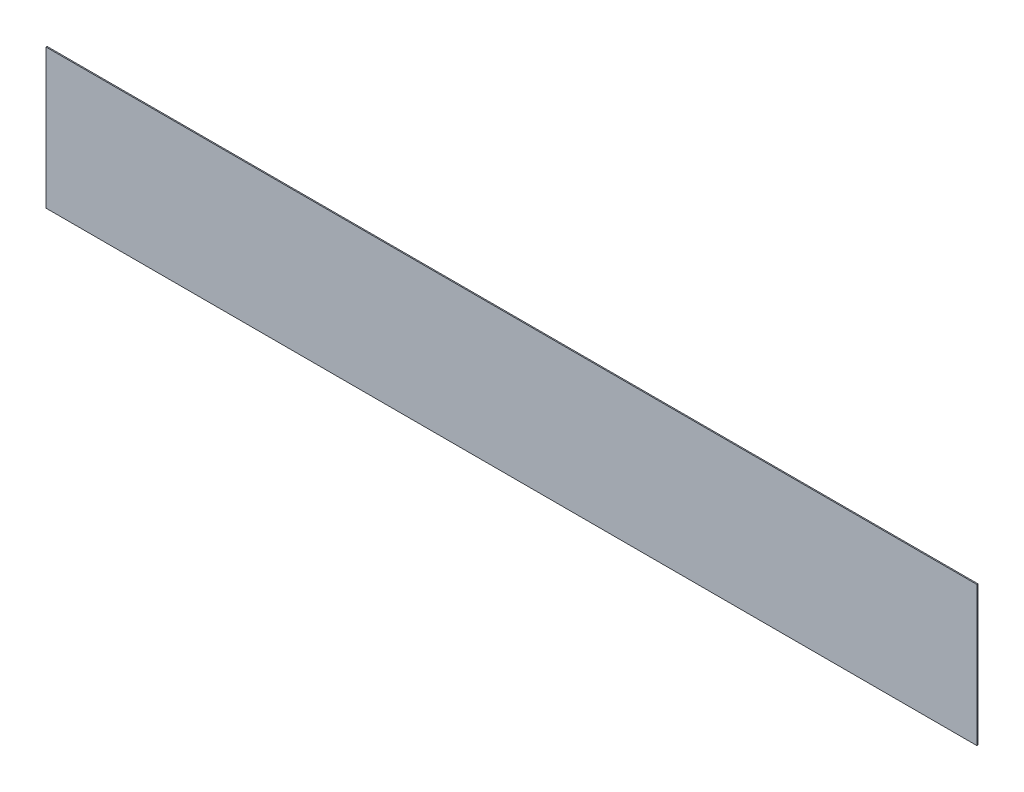
ISO-10303-21;
HEADER;
FILE_DESCRIPTION(('STEP AP214'),'2;1');
FILE_NAME('part.step','',(''),(''),'','','');
FILE_SCHEMA(('AUTOMOTIVE_DESIGN { 1 0 10303 214 1 1 1 1 }'));
ENDSEC;
DATA;
#1=APPLICATION_CONTEXT('core data for automotive mechanical design processes');
#2=APPLICATION_PROTOCOL_DEFINITION('international standard','automotive_design',2000,#1);
#3=PRODUCT_CONTEXT('',#1,'mechanical');
#4=PRODUCT('Part','Part','',(#3));
#5=PRODUCT_RELATED_PRODUCT_CATEGORY('part','',(#4));
#6=PRODUCT_DEFINITION_FORMATION('','',#4);
#7=PRODUCT_DEFINITION_CONTEXT('part definition',#1,'design');
#8=PRODUCT_DEFINITION('design','',#6,#7);
#9=PRODUCT_DEFINITION_SHAPE('','',#8);
#10=(LENGTH_UNIT() NAMED_UNIT(*) SI_UNIT(.MILLI.,.METRE.));
#11=(NAMED_UNIT(*) PLANE_ANGLE_UNIT() SI_UNIT($,.RADIAN.));
#12=(NAMED_UNIT(*) SI_UNIT($,.STERADIAN.) SOLID_ANGLE_UNIT());
#13=UNCERTAINTY_MEASURE_WITH_UNIT(LENGTH_MEASURE(1.E-05),#10,'distance_accuracy_value','');
#14=(GEOMETRIC_REPRESENTATION_CONTEXT(3) GLOBAL_UNCERTAINTY_ASSIGNED_CONTEXT((#13)) GLOBAL_UNIT_ASSIGNED_CONTEXT((#10,
#11,#12)) REPRESENTATION_CONTEXT('',''));
#15=CARTESIAN_POINT('',(0.,0.,0.));
#16=DIRECTION('',(0.,0.,1.));
#17=DIRECTION('',(1.,0.,0.));
#18=AXIS2_PLACEMENT_3D('',#15,#16,#17);
#19=CARTESIAN_POINT('',(0.,0.,0.));
#20=DIRECTION('',(0.,0.,1.));
#21=DIRECTION('',(1.,0.,0.));
#22=AXIS2_PLACEMENT_3D('',#19,#20,#21);
#23=PLANE('',#22);
#24=DIRECTION('',(1.,0.,0.));
#25=VECTOR('',#24,1.);
#26=CARTESIAN_POINT('',(42.35,6.35,0.));
#27=LINE('',#26,#25);
#28=CARTESIAN_POINT('',(42.35,6.35,0.));
#29=VERTEX_POINT('',#28);
#30=CARTESIAN_POINT('',(-42.35,6.35,0.));
#31=VERTEX_POINT('',#30);
#32=EDGE_CURVE('E78',#29,#31,#27,.F.);
#33=ORIENTED_EDGE('',*,*,#32,.F.);
#34=DIRECTION('',(0.,1.,0.));
#35=VECTOR('',#34,1.);
#36=CARTESIAN_POINT('',(42.35,-6.35,0.));
#37=LINE('',#36,#35);
#38=CARTESIAN_POINT('',(42.35,-6.35,0.));
#39=VERTEX_POINT('',#38);
#40=EDGE_CURVE('E54',#39,#29,#37,.T.);
#41=ORIENTED_EDGE('',*,*,#40,.F.);
#42=DIRECTION('',(1.,0.,0.));
#43=VECTOR('',#42,1.);
#44=CARTESIAN_POINT('',(-42.35,-6.35,0.));
#45=LINE('',#44,#43);
#46=CARTESIAN_POINT('',(-42.35,-6.35,0.));
#47=VERTEX_POINT('',#46);
#48=EDGE_CURVE('E56',#47,#39,#45,.T.);
#49=ORIENTED_EDGE('',*,*,#48,.F.);
#50=DIRECTION('',(0.,1.,0.));
#51=VECTOR('',#50,1.);
#52=CARTESIAN_POINT('',(-42.35,6.35,0.));
#53=LINE('',#52,#51);
#54=EDGE_CURVE('E19',#31,#47,#53,.F.);
#55=ORIENTED_EDGE('',*,*,#54,.F.);
#56=EDGE_LOOP('',(#33,#41,#49,#55));
#57=FACE_BOUND('',#56,.T.);
#58=ADVANCED_FACE('F16',(#57),#23,.F.);
#59=CARTESIAN_POINT('',(-42.35,6.35,0.));
#60=DIRECTION('',(-1.,0.,0.));
#61=DIRECTION('',(0.,0.,1.));
#62=AXIS2_PLACEMENT_3D('',#59,#60,#61);
#63=PLANE('',#62);
#64=DIRECTION('',(0.,1.,0.));
#65=VECTOR('',#64,1.);
#66=CARTESIAN_POINT('',(-42.35,0.,0.1));
#67=LINE('',#66,#65);
#68=CARTESIAN_POINT('',(-42.35,6.35,0.1));
#69=VERTEX_POINT('',#68);
#70=CARTESIAN_POINT('',(-42.35,-6.35,0.1));
#71=VERTEX_POINT('',#70);
#72=EDGE_CURVE('E82',#69,#71,#67,.F.);
#73=ORIENTED_EDGE('',*,*,#72,.F.);
#74=DIRECTION('',(0.,0.,1.));
#75=VECTOR('',#74,1.);
#76=CARTESIAN_POINT('',(-42.35,6.35,0.));
#77=LINE('',#76,#75);
#78=EDGE_CURVE('E67',#31,#69,#77,.T.);
#79=ORIENTED_EDGE('',*,*,#78,.F.);
#80=ORIENTED_EDGE('',*,*,#54,.T.);
#81=DIRECTION('',(0.,0.,-1.));
#82=VECTOR('',#81,1.);
#83=CARTESIAN_POINT('',(-42.35,-6.35,0.));
#84=LINE('',#83,#82);
#85=EDGE_CURVE('E62',#71,#47,#84,.T.);
#86=ORIENTED_EDGE('',*,*,#85,.F.);
#87=EDGE_LOOP('',(#73,#79,#80,#86));
#88=FACE_BOUND('',#87,.T.);
#89=ADVANCED_FACE('F64',(#88),#63,.T.);
#90=CARTESIAN_POINT('',(-42.35,-6.35,0.));
#91=DIRECTION('',(0.,-1.,0.));
#92=DIRECTION('',(0.,0.,-1.));
#93=AXIS2_PLACEMENT_3D('',#90,#91,#92);
#94=PLANE('',#93);
#95=DIRECTION('',(1.,0.,0.));
#96=VECTOR('',#95,1.);
#97=CARTESIAN_POINT('',(0.,-6.35,0.1));
#98=LINE('',#97,#96);
#99=CARTESIAN_POINT('',(42.35,-6.35,0.1));
#100=VERTEX_POINT('',#99);
#101=EDGE_CURVE('E71',#71,#100,#98,.T.);
#102=ORIENTED_EDGE('',*,*,#101,.F.);
#103=ORIENTED_EDGE('',*,*,#85,.T.);
#104=ORIENTED_EDGE('',*,*,#48,.T.);
#105=DIRECTION('',(0.,0.,-1.));
#106=VECTOR('',#105,1.);
#107=CARTESIAN_POINT('',(42.35,-6.35,0.));
#108=LINE('',#107,#106);
#109=EDGE_CURVE('E74',#100,#39,#108,.T.);
#110=ORIENTED_EDGE('',*,*,#109,.F.);
#111=EDGE_LOOP('',(#102,#103,#104,#110));
#112=FACE_BOUND('',#111,.T.);
#113=ADVANCED_FACE('F69',(#112),#94,.T.);
#114=CARTESIAN_POINT('',(42.35,-6.35,0.));
#115=DIRECTION('',(1.,0.,0.));
#116=DIRECTION('',(0.,0.,-1.));
#117=AXIS2_PLACEMENT_3D('',#114,#115,#116);
#118=PLANE('',#117);
#119=DIRECTION('',(0.,1.,0.));
#120=VECTOR('',#119,1.);
#121=CARTESIAN_POINT('',(42.35,0.,0.1));
#122=LINE('',#121,#120);
#123=CARTESIAN_POINT('',(42.35,6.35,0.1));
#124=VERTEX_POINT('',#123);
#125=EDGE_CURVE('E25',#100,#124,#122,.T.);
#126=ORIENTED_EDGE('',*,*,#125,.F.);
#127=ORIENTED_EDGE('',*,*,#109,.T.);
#128=ORIENTED_EDGE('',*,*,#40,.T.);
#129=DIRECTION('',(0.,0.,1.));
#130=VECTOR('',#129,1.);
#131=CARTESIAN_POINT('',(42.35,6.35,0.));
#132=LINE('',#131,#130);
#133=EDGE_CURVE('E34',#124,#29,#132,.F.);
#134=ORIENTED_EDGE('',*,*,#133,.F.);
#135=EDGE_LOOP('',(#126,#127,#128,#134));
#136=FACE_BOUND('',#135,.T.);
#137=ADVANCED_FACE('F88',(#136),#118,.T.);
#138=CARTESIAN_POINT('',(42.35,6.35,0.));
#139=DIRECTION('',(0.,1.,0.));
#140=DIRECTION('',(0.,0.,1.));
#141=AXIS2_PLACEMENT_3D('',#138,#139,#140);
#142=PLANE('',#141);
#143=DIRECTION('',(1.,0.,0.));
#144=VECTOR('',#143,1.);
#145=CARTESIAN_POINT('',(0.,6.35,0.1));
#146=LINE('',#145,#144);
#147=EDGE_CURVE('E10',#124,#69,#146,.F.);
#148=ORIENTED_EDGE('',*,*,#147,.F.);
#149=ORIENTED_EDGE('',*,*,#133,.T.);
#150=ORIENTED_EDGE('',*,*,#32,.T.);
#151=ORIENTED_EDGE('',*,*,#78,.T.);
#152=EDGE_LOOP('',(#148,#149,#150,#151));
#153=FACE_BOUND('',#152,.T.);
#154=ADVANCED_FACE('F90',(#153),#142,.T.);
#155=CARTESIAN_POINT('',(0.,0.,0.1));
#156=DIRECTION('',(0.,0.,1.));
#157=DIRECTION('',(1.,0.,0.));
#158=AXIS2_PLACEMENT_3D('',#155,#156,#157);
#159=PLANE('',#158);
#160=ORIENTED_EDGE('',*,*,#125,.T.);
#161=ORIENTED_EDGE('',*,*,#147,.T.);
#162=ORIENTED_EDGE('',*,*,#72,.T.);
#163=ORIENTED_EDGE('',*,*,#101,.T.);
#164=EDGE_LOOP('',(#160,#161,#162,#163));
#165=FACE_BOUND('',#164,.T.);
#166=ADVANCED_FACE('F87',(#165),#159,.T.);
#167=CLOSED_SHELL('',(#58,#89,#113,#137,#154,#166));
#168=MANIFOLD_SOLID_BREP('B1',#167);
#169=ADVANCED_BREP_SHAPE_REPRESENTATION('',(#18,#168),#14);
#170=SHAPE_DEFINITION_REPRESENTATION(#9,#169);
ENDSEC;
END-ISO-10303-21;
